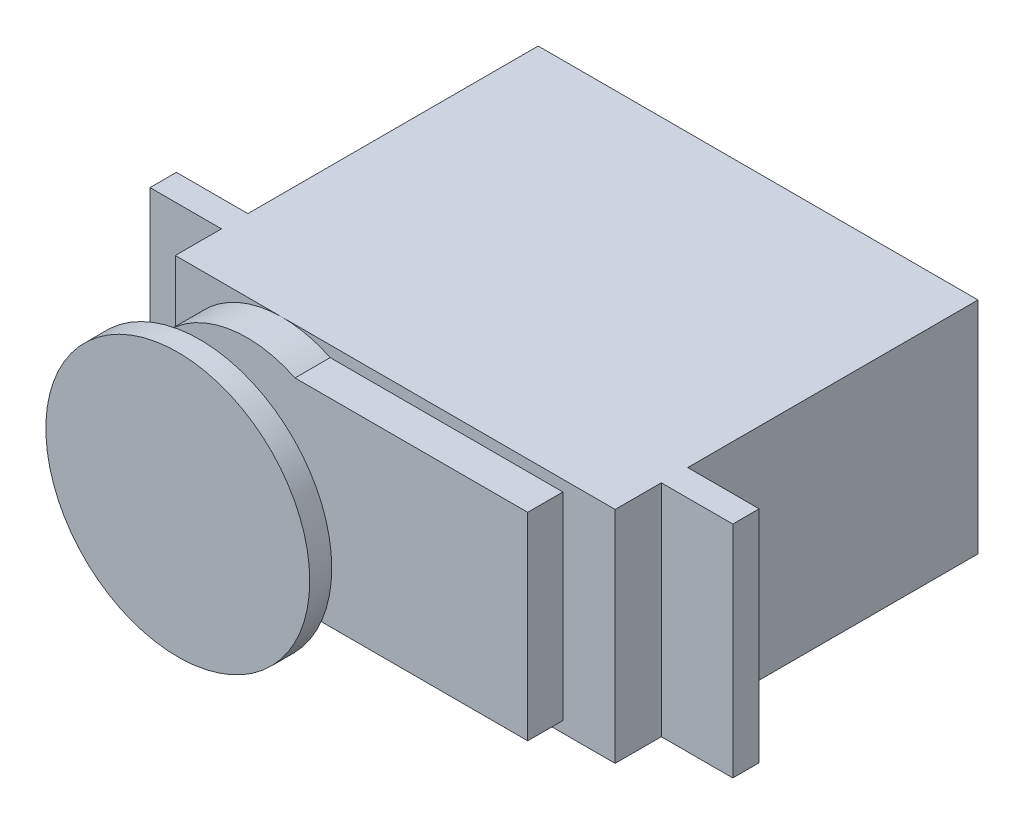
ISO-10303-21;
HEADER;
FILE_DESCRIPTION(('STEP AP214'),'2;1');
FILE_NAME('part.step','',(''),(''),'','','');
FILE_SCHEMA(('AUTOMOTIVE_DESIGN { 1 0 10303 214 1 1 1 1 }'));
ENDSEC;
DATA;
#1=APPLICATION_CONTEXT('core data for automotive mechanical design processes');
#2=APPLICATION_PROTOCOL_DEFINITION('international standard','automotive_design',2000,#1);
#3=PRODUCT_CONTEXT('',#1,'mechanical');
#4=PRODUCT('Part','Part','',(#3));
#5=PRODUCT_RELATED_PRODUCT_CATEGORY('part','',(#4));
#6=PRODUCT_DEFINITION_FORMATION('','',#4);
#7=PRODUCT_DEFINITION_CONTEXT('part definition',#1,'design');
#8=PRODUCT_DEFINITION('design','',#6,#7);
#9=PRODUCT_DEFINITION_SHAPE('','',#8);
#10=(LENGTH_UNIT() NAMED_UNIT(*) SI_UNIT(.MILLI.,.METRE.));
#11=(NAMED_UNIT(*) PLANE_ANGLE_UNIT() SI_UNIT($,.RADIAN.));
#12=(NAMED_UNIT(*) SI_UNIT($,.STERADIAN.) SOLID_ANGLE_UNIT());
#13=UNCERTAINTY_MEASURE_WITH_UNIT(LENGTH_MEASURE(1.E-05),#10,'distance_accuracy_value','');
#14=(GEOMETRIC_REPRESENTATION_CONTEXT(3) GLOBAL_UNCERTAINTY_ASSIGNED_CONTEXT((#13)) GLOBAL_UNIT_ASSIGNED_CONTEXT((#10,
#11,#12)) REPRESENTATION_CONTEXT('',''));
#15=CARTESIAN_POINT('',(0.,0.,0.));
#16=DIRECTION('',(0.,0.,1.));
#17=DIRECTION('',(1.,0.,0.));
#18=AXIS2_PLACEMENT_3D('',#15,#16,#17);
#19=CARTESIAN_POINT('',(9.72641767332185,10.,40.5));
#20=DIRECTION('',(0.,0.,-1.));
#21=DIRECTION('',(-1.,0.,0.));
#22=AXIS2_PLACEMENT_3D('',#19,#20,#21);
#23=CYLINDRICAL_SURFACE('',#22,5.);
#24=CARTESIAN_POINT('',(9.72641767332185,10.,36.2));
#25=DIRECTION('',(0.,0.,1.));
#26=DIRECTION('',(1.,0.,0.));
#27=AXIS2_PLACEMENT_3D('',#24,#25,#26);
#28=CIRCLE('',#27,5.);
#29=CARTESIAN_POINT('',(14.7264176733219,10.,36.2));
#30=VERTEX_POINT('',#29);
#31=EDGE_CURVE('E208',#30,#30,#28,.F.);
#32=ORIENTED_EDGE('',*,*,#31,.F.);
#33=EDGE_LOOP('',(#32));
#34=FACE_BOUND('',#33,.T.);
#35=CARTESIAN_POINT('',(9.72641767332185,10.,40.5));
#36=DIRECTION('',(0.,0.,1.));
#37=DIRECTION('',(1.,0.,0.));
#38=AXIS2_PLACEMENT_3D('',#35,#36,#37);
#39=CIRCLE('',#38,5.);
#40=CARTESIAN_POINT('',(14.7264176733219,10.,40.5));
#41=VERTEX_POINT('',#40);
#42=EDGE_CURVE('E231',#41,#41,#39,.T.);
#43=ORIENTED_EDGE('',*,*,#42,.F.);
#44=EDGE_LOOP('',(#43));
#45=FACE_BOUND('',#44,.T.);
#46=ADVANCED_FACE('F33',(#34,#45),#23,.T.);
#47=CARTESIAN_POINT('',(9.72641767332185,10.,40.5));
#48=DIRECTION('',(0.,0.,1.));
#49=DIRECTION('',(1.,0.,0.));
#50=AXIS2_PLACEMENT_3D('',#47,#48,#49);
#51=PLANE('',#50);
#52=CARTESIAN_POINT('',(9.72641767332185,10.,40.5));
#53=DIRECTION('',(0.,0.,1.));
#54=DIRECTION('',(1.,0.,0.));
#55=AXIS2_PLACEMENT_3D('',#52,#53,#54);
#56=CIRCLE('',#55,12.);
#57=CARTESIAN_POINT('',(21.7264176733219,10.,40.5));
#58=VERTEX_POINT('',#57);
#59=EDGE_CURVE('E176',#58,#58,#56,.T.);
#60=ORIENTED_EDGE('',*,*,#59,.F.);
#61=EDGE_LOOP('',(#60));
#62=FACE_BOUND('',#61,.T.);
#63=ORIENTED_EDGE('',*,*,#42,.T.);
#64=EDGE_LOOP('',(#63));
#65=FACE_BOUND('',#64,.T.);
#66=ADVANCED_FACE('F411',(#62,#65),#51,.F.);
#67=CARTESIAN_POINT('',(9.72641767332185,10.,42.5));
#68=DIRECTION('',(0.,0.,-1.));
#69=DIRECTION('',(-1.,0.,0.));
#70=AXIS2_PLACEMENT_3D('',#67,#68,#69);
#71=CYLINDRICAL_SURFACE('',#70,12.);
#72=CARTESIAN_POINT('',(9.72641767332185,10.,42.5));
#73=DIRECTION('',(0.,0.,1.));
#74=DIRECTION('',(1.,0.,0.));
#75=AXIS2_PLACEMENT_3D('',#72,#73,#74);
#76=CIRCLE('',#75,12.);
#77=CARTESIAN_POINT('',(21.7264176733219,10.,42.5));
#78=VERTEX_POINT('',#77);
#79=EDGE_CURVE('E228',#78,#78,#76,.T.);
#80=ORIENTED_EDGE('',*,*,#79,.F.);
#81=EDGE_LOOP('',(#80));
#82=FACE_BOUND('',#81,.T.);
#83=ORIENTED_EDGE('',*,*,#59,.T.);
#84=EDGE_LOOP('',(#83));
#85=FACE_BOUND('',#84,.T.);
#86=ADVANCED_FACE('F417',(#82,#85),#71,.T.);
#87=CARTESIAN_POINT('',(9.72641767332185,10.,42.5));
#88=DIRECTION('',(0.,0.,1.));
#89=DIRECTION('',(1.,0.,0.));
#90=AXIS2_PLACEMENT_3D('',#87,#88,#89);
#91=PLANE('',#90);
#92=ORIENTED_EDGE('',*,*,#79,.T.);
#93=EDGE_LOOP('',(#92));
#94=FACE_BOUND('',#93,.T.);
#95=ADVANCED_FACE('F482',(#94),#91,.T.);
#96=CARTESIAN_POINT('',(9.72641767332185,10.,36.2));
#97=DIRECTION('',(0.,0.,-1.));
#98=DIRECTION('',(-1.,0.,0.));
#99=AXIS2_PLACEMENT_3D('',#96,#97,#98);
#100=CYLINDRICAL_SURFACE('',#99,10.);
#101=CARTESIAN_POINT('',(9.72641767332185,10.,33.));
#102=DIRECTION('',(0.,0.,1.));
#103=DIRECTION('',(1.,0.,0.));
#104=AXIS2_PLACEMENT_3D('',#101,#102,#103);
#105=CIRCLE('',#104,10.);
#106=CARTESIAN_POINT('',(0.,12.3231012126234,33.));
#107=VERTEX_POINT('',#106);
#108=CARTESIAN_POINT('',(9.72641767332185,20.,33.));
#109=VERTEX_POINT('',#108);
#110=EDGE_CURVE('E173',#107,#109,#105,.F.);
#111=ORIENTED_EDGE('',*,*,#110,.F.);
#112=DIRECTION('',(0.,0.,-1.));
#113=VECTOR('',#112,1.);
#114=CARTESIAN_POINT('',(0.,12.3231012126234,36.2));
#115=LINE('',#114,#113);
#116=CARTESIAN_POINT('',(0.,12.3231012126234,36.2));
#117=VERTEX_POINT('',#116);
#118=EDGE_CURVE('E166',#117,#107,#115,.T.);
#119=ORIENTED_EDGE('',*,*,#118,.F.);
#120=CARTESIAN_POINT('',(9.72641767332185,10.,36.2));
#121=DIRECTION('',(0.,0.,1.));
#122=DIRECTION('',(1.,0.,0.));
#123=AXIS2_PLACEMENT_3D('',#120,#121,#122);
#124=CIRCLE('',#123,10.);
#125=CARTESIAN_POINT('',(14.0853166168625,19.,36.2));
#126=VERTEX_POINT('',#125);
#127=EDGE_CURVE('E171',#117,#126,#124,.F.);
#128=ORIENTED_EDGE('',*,*,#127,.T.);
#129=DIRECTION('',(0.,0.,-1.));
#130=VECTOR('',#129,1.);
#131=CARTESIAN_POINT('',(14.0853166168625,19.,36.2));
#132=LINE('',#131,#130);
#133=CARTESIAN_POINT('',(14.0853166168625,19.,33.));
#134=VERTEX_POINT('',#133);
#135=EDGE_CURVE('E211',#126,#134,#132,.T.);
#136=ORIENTED_EDGE('',*,*,#135,.T.);
#137=EDGE_CURVE('E214',#109,#134,#105,.F.);
#138=ORIENTED_EDGE('',*,*,#137,.F.);
#139=EDGE_LOOP('',(#111,#119,#128,#136,#138));
#140=FACE_BOUND('',#139,.T.);
#141=ADVANCED_FACE('F168',(#140),#100,.T.);
#142=CARTESIAN_POINT('',(9.72641767332185,10.,36.2));
#143=DIRECTION('',(0.,0.,-1.));
#144=DIRECTION('',(-1.,0.,0.));
#145=AXIS2_PLACEMENT_3D('',#142,#143,#144);
#146=CYLINDRICAL_SURFACE('',#145,10.);
#147=CARTESIAN_POINT('',(9.72641767332185,10.,33.));
#148=DIRECTION('',(0.,0.,1.));
#149=DIRECTION('',(1.,0.,0.));
#150=AXIS2_PLACEMENT_3D('',#147,#148,#149);
#151=CIRCLE('',#150,10.);
#152=CARTESIAN_POINT('',(14.0853166168625,0.999999999999996,33.));
#153=VERTEX_POINT('',#152);
#154=CARTESIAN_POINT('',(9.72641767332185,0.,33.));
#155=VERTEX_POINT('',#154);
#156=EDGE_CURVE('E215',#153,#155,#151,.F.);
#157=ORIENTED_EDGE('',*,*,#156,.F.);
#158=DIRECTION('',(0.,0.,-1.));
#159=VECTOR('',#158,1.);
#160=CARTESIAN_POINT('',(14.0853166168625,0.999999999999997,36.2));
#161=LINE('',#160,#159);
#162=CARTESIAN_POINT('',(14.0853166168625,0.999999999999997,36.2));
#163=VERTEX_POINT('',#162);
#164=EDGE_CURVE('E225',#163,#153,#161,.T.);
#165=ORIENTED_EDGE('',*,*,#164,.F.);
#166=CARTESIAN_POINT('',(9.72641767332185,10.,36.2));
#167=DIRECTION('',(0.,0.,1.));
#168=DIRECTION('',(1.,0.,0.));
#169=AXIS2_PLACEMENT_3D('',#166,#167,#168);
#170=CIRCLE('',#169,10.);
#171=CARTESIAN_POINT('',(0.,7.6768987873766,36.2));
#172=VERTEX_POINT('',#171);
#173=EDGE_CURVE('E187',#163,#172,#170,.F.);
#174=ORIENTED_EDGE('',*,*,#173,.T.);
#175=DIRECTION('',(0.,0.,-1.));
#176=VECTOR('',#175,1.);
#177=CARTESIAN_POINT('',(0.,7.6768987873766,36.2));
#178=LINE('',#177,#176);
#179=CARTESIAN_POINT('',(0.,7.6768987873766,33.));
#180=VERTEX_POINT('',#179);
#181=EDGE_CURVE('E177',#172,#180,#178,.T.);
#182=ORIENTED_EDGE('',*,*,#181,.T.);
#183=EDGE_CURVE('E213',#155,#180,#151,.F.);
#184=ORIENTED_EDGE('',*,*,#183,.F.);
#185=EDGE_LOOP('',(#157,#165,#174,#182,#184));
#186=FACE_BOUND('',#185,.T.);
#187=ADVANCED_FACE('F377',(#186),#146,.T.);
#188=CARTESIAN_POINT('',(19.8632088366609,0.999999999999997,36.2));
#189=DIRECTION('',(0.,-1.,0.));
#190=DIRECTION('',(1.,0.,0.));
#191=AXIS2_PLACEMENT_3D('',#188,#189,#190);
#192=PLANE('',#191);
#193=DIRECTION('',(-1.,0.,0.));
#194=VECTOR('',#193,1.);
#195=CARTESIAN_POINT('',(19.8632088366609,0.999999999999997,33.));
#196=LINE('',#195,#194);
#197=CARTESIAN_POINT('',(35.25,1.,33.));
#198=VERTEX_POINT('',#197);
#199=EDGE_CURVE('E50',#198,#153,#196,.T.);
#200=ORIENTED_EDGE('',*,*,#199,.F.);
#201=DIRECTION('',(0.,0.,-1.));
#202=VECTOR('',#201,1.);
#203=CARTESIAN_POINT('',(35.25,1.,36.2));
#204=LINE('',#203,#202);
#205=CARTESIAN_POINT('',(35.25,1.,36.2));
#206=VERTEX_POINT('',#205);
#207=EDGE_CURVE('E223',#206,#198,#204,.T.);
#208=ORIENTED_EDGE('',*,*,#207,.F.);
#209=DIRECTION('',(-1.,0.,0.));
#210=VECTOR('',#209,1.);
#211=CARTESIAN_POINT('',(19.8632088366609,0.999999999999997,36.2));
#212=LINE('',#211,#210);
#213=EDGE_CURVE('E201',#206,#163,#212,.T.);
#214=ORIENTED_EDGE('',*,*,#213,.T.);
#215=ORIENTED_EDGE('',*,*,#164,.T.);
#216=EDGE_LOOP('',(#200,#208,#214,#215));
#217=FACE_BOUND('',#216,.T.);
#218=ADVANCED_FACE('F380',(#217),#192,.T.);
#219=CARTESIAN_POINT('',(35.25,-25.116936609359,36.2));
#220=DIRECTION('',(1.,0.,0.));
#221=DIRECTION('',(0.,0.,-1.));
#222=AXIS2_PLACEMENT_3D('',#219,#220,#221);
#223=PLANE('',#222);
#224=DIRECTION('',(0.,-1.,0.));
#225=VECTOR('',#224,1.);
#226=CARTESIAN_POINT('',(35.25,-25.116936609359,33.));
#227=LINE('',#226,#225);
#228=CARTESIAN_POINT('',(35.25,19.,33.));
#229=VERTEX_POINT('',#228);
#230=EDGE_CURVE('E55',#229,#198,#227,.T.);
#231=ORIENTED_EDGE('',*,*,#230,.F.);
#232=DIRECTION('',(0.,0.,-1.));
#233=VECTOR('',#232,1.);
#234=CARTESIAN_POINT('',(35.25,19.,36.2));
#235=LINE('',#234,#233);
#236=CARTESIAN_POINT('',(35.25,19.,36.2));
#237=VERTEX_POINT('',#236);
#238=EDGE_CURVE('E220',#237,#229,#235,.T.);
#239=ORIENTED_EDGE('',*,*,#238,.F.);
#240=DIRECTION('',(0.,-1.,0.));
#241=VECTOR('',#240,1.);
#242=CARTESIAN_POINT('',(35.25,-25.116936609359,36.2));
#243=LINE('',#242,#241);
#244=EDGE_CURVE('E204',#237,#206,#243,.T.);
#245=ORIENTED_EDGE('',*,*,#244,.T.);
#246=ORIENTED_EDGE('',*,*,#207,.T.);
#247=EDGE_LOOP('',(#231,#239,#245,#246));
#248=FACE_BOUND('',#247,.T.);
#249=ADVANCED_FACE('F382',(#248),#223,.T.);
#250=CARTESIAN_POINT('',(19.8632088366609,19.,36.2));
#251=DIRECTION('',(0.,-1.,0.));
#252=DIRECTION('',(1.,0.,0.));
#253=AXIS2_PLACEMENT_3D('',#250,#251,#252);
#254=PLANE('',#253);
#255=DIRECTION('',(-1.,0.,0.));
#256=VECTOR('',#255,1.);
#257=CARTESIAN_POINT('',(19.8632088366609,19.,33.));
#258=LINE('',#257,#256);
#259=EDGE_CURVE('E195',#229,#134,#258,.T.);
#260=ORIENTED_EDGE('',*,*,#259,.T.);
#261=ORIENTED_EDGE('',*,*,#135,.F.);
#262=DIRECTION('',(-1.,0.,0.));
#263=VECTOR('',#262,1.);
#264=CARTESIAN_POINT('',(19.8632088366609,19.,36.2));
#265=LINE('',#264,#263);
#266=EDGE_CURVE('E193',#237,#126,#265,.T.);
#267=ORIENTED_EDGE('',*,*,#266,.F.);
#268=ORIENTED_EDGE('',*,*,#238,.T.);
#269=EDGE_LOOP('',(#260,#261,#267,#268));
#270=FACE_BOUND('',#269,.T.);
#271=ADVANCED_FACE('F384',(#270),#254,.F.);
#272=CARTESIAN_POINT('',(19.8632088366609,-25.116936609359,36.2));
#273=DIRECTION('',(0.,0.,1.));
#274=DIRECTION('',(1.,0.,0.));
#275=AXIS2_PLACEMENT_3D('',#272,#273,#274);
#276=PLANE('',#275);
#277=ORIENTED_EDGE('',*,*,#127,.F.);
#278=DIRECTION('',(0.,-1.,0.));
#279=VECTOR('',#278,1.);
#280=CARTESIAN_POINT('',(0.,-25.116936609359,36.2));
#281=LINE('',#280,#279);
#282=EDGE_CURVE('E180',#117,#172,#281,.T.);
#283=ORIENTED_EDGE('',*,*,#282,.T.);
#284=ORIENTED_EDGE('',*,*,#173,.F.);
#285=ORIENTED_EDGE('',*,*,#213,.F.);
#286=ORIENTED_EDGE('',*,*,#244,.F.);
#287=ORIENTED_EDGE('',*,*,#266,.T.);
#288=EDGE_LOOP('',(#277,#283,#284,#285,#286,#287));
#289=FACE_BOUND('',#288,.T.);
#290=ORIENTED_EDGE('',*,*,#31,.T.);
#291=EDGE_LOOP('',(#290));
#292=FACE_BOUND('',#291,.T.);
#293=ADVANCED_FACE('F189',(#289,#292),#276,.T.);
#294=CARTESIAN_POINT('',(46.5,0.,28.8));
#295=DIRECTION('',(1.,0.,0.));
#296=DIRECTION('',(0.,0.,-1.));
#297=AXIS2_PLACEMENT_3D('',#294,#295,#296);
#298=PLANE('',#297);
#299=DIRECTION('',(0.,-1.,0.));
#300=VECTOR('',#299,1.);
#301=CARTESIAN_POINT('',(46.5,20.,28.8));
#302=LINE('',#301,#300);
#303=CARTESIAN_POINT('',(46.5,20.,28.8));
#304=VERTEX_POINT('',#303);
#305=CARTESIAN_POINT('',(46.5,0.,28.8));
#306=VERTEX_POINT('',#305);
#307=EDGE_CURVE('E264',#304,#306,#302,.T.);
#308=ORIENTED_EDGE('',*,*,#307,.T.);
#309=DIRECTION('',(0.,0.,-1.));
#310=VECTOR('',#309,1.);
#311=CARTESIAN_POINT('',(46.5,0.,28.8));
#312=LINE('',#311,#310);
#313=CARTESIAN_POINT('',(46.5,0.,26.4));
#314=VERTEX_POINT('',#313);
#315=EDGE_CURVE('E267',#306,#314,#312,.T.);
#316=ORIENTED_EDGE('',*,*,#315,.T.);
#317=DIRECTION('',(0.,1.,0.));
#318=VECTOR('',#317,1.);
#319=CARTESIAN_POINT('',(46.5,20.,26.4));
#320=LINE('',#319,#318);
#321=CARTESIAN_POINT('',(46.5,20.,26.4));
#322=VERTEX_POINT('',#321);
#323=EDGE_CURVE('E270',#314,#322,#320,.T.);
#324=ORIENTED_EDGE('',*,*,#323,.T.);
#325=DIRECTION('',(0.,0.,1.));
#326=VECTOR('',#325,1.);
#327=CARTESIAN_POINT('',(46.5,20.,28.8));
#328=LINE('',#327,#326);
#329=EDGE_CURVE('E272',#322,#304,#328,.T.);
#330=ORIENTED_EDGE('',*,*,#329,.T.);
#331=EDGE_LOOP('',(#308,#316,#324,#330));
#332=FACE_BOUND('',#331,.T.);
#333=ADVANCED_FACE('F429',(#332),#298,.T.);
#334=CARTESIAN_POINT('',(46.5,20.,28.8));
#335=DIRECTION('',(0.,0.,-1.));
#336=DIRECTION('',(0.,1.,0.));
#337=AXIS2_PLACEMENT_3D('',#334,#335,#336);
#338=PLANE('',#337);
#339=DIRECTION('',(0.,-1.,0.));
#340=VECTOR('',#339,1.);
#341=CARTESIAN_POINT('',(40.,20.,28.8));
#342=LINE('',#341,#340);
#343=CARTESIAN_POINT('',(40.,20.,28.8));
#344=VERTEX_POINT('',#343);
#345=CARTESIAN_POINT('',(40.,0.,28.8));
#346=VERTEX_POINT('',#345);
#347=EDGE_CURVE('E263',#344,#346,#342,.T.);
#348=ORIENTED_EDGE('',*,*,#347,.T.);
#349=DIRECTION('',(-1.,0.,0.));
#350=VECTOR('',#349,1.);
#351=CARTESIAN_POINT('',(46.5,0.,28.8));
#352=LINE('',#351,#350);
#353=EDGE_CURVE('E296',#306,#346,#352,.T.);
#354=ORIENTED_EDGE('',*,*,#353,.F.);
#355=ORIENTED_EDGE('',*,*,#307,.F.);
#356=DIRECTION('',(-1.,0.,0.));
#357=VECTOR('',#356,1.);
#358=CARTESIAN_POINT('',(46.5,20.,28.8));
#359=LINE('',#358,#357);
#360=EDGE_CURVE('E274',#304,#344,#359,.T.);
#361=ORIENTED_EDGE('',*,*,#360,.T.);
#362=EDGE_LOOP('',(#348,#354,#355,#361));
#363=FACE_BOUND('',#362,.T.);
#364=ADVANCED_FACE('F425',(#363),#338,.F.);
#365=CARTESIAN_POINT('',(-6.50000000000001,0.,28.8));
#366=DIRECTION('',(1.,0.,0.));
#367=DIRECTION('',(0.,0.,-1.));
#368=AXIS2_PLACEMENT_3D('',#365,#366,#367);
#369=PLANE('',#368);
#370=DIRECTION('',(0.,-1.,0.));
#371=VECTOR('',#370,1.);
#372=CARTESIAN_POINT('',(-6.50000000000001,20.,28.8));
#373=LINE('',#372,#371);
#374=CARTESIAN_POINT('',(-6.50000000000001,20.,28.8));
#375=VERTEX_POINT('',#374);
#376=CARTESIAN_POINT('',(-6.50000000000001,0.,28.8));
#377=VERTEX_POINT('',#376);
#378=EDGE_CURVE('E236',#375,#377,#373,.T.);
#379=ORIENTED_EDGE('',*,*,#378,.F.);
#380=DIRECTION('',(0.,0.,1.));
#381=VECTOR('',#380,1.);
#382=CARTESIAN_POINT('',(-6.50000000000001,20.,28.8));
#383=LINE('',#382,#381);
#384=CARTESIAN_POINT('',(-6.50000000000001,20.,26.4));
#385=VERTEX_POINT('',#384);
#386=EDGE_CURVE('E245',#385,#375,#383,.T.);
#387=ORIENTED_EDGE('',*,*,#386,.F.);
#388=DIRECTION('',(0.,1.,0.));
#389=VECTOR('',#388,1.);
#390=CARTESIAN_POINT('',(-6.50000000000001,20.,26.4));
#391=LINE('',#390,#389);
#392=CARTESIAN_POINT('',(-6.50000000000001,0.,26.4));
#393=VERTEX_POINT('',#392);
#394=EDGE_CURVE('E242',#393,#385,#391,.T.);
#395=ORIENTED_EDGE('',*,*,#394,.F.);
#396=DIRECTION('',(0.,0.,-1.));
#397=VECTOR('',#396,1.);
#398=CARTESIAN_POINT('',(-6.50000000000001,0.,28.8));
#399=LINE('',#398,#397);
#400=EDGE_CURVE('E239',#377,#393,#399,.T.);
#401=ORIENTED_EDGE('',*,*,#400,.F.);
#402=EDGE_LOOP('',(#379,#387,#395,#401));
#403=FACE_BOUND('',#402,.T.);
#404=ADVANCED_FACE('F398',(#403),#369,.F.);
#405=CARTESIAN_POINT('',(-6.50000000000001,20.,26.4));
#406=DIRECTION('',(0.,0.,-1.));
#407=DIRECTION('',(0.,1.,0.));
#408=AXIS2_PLACEMENT_3D('',#405,#406,#407);
#409=PLANE('',#408);
#410=DIRECTION('',(0.,1.,0.));
#411=VECTOR('',#410,1.);
#412=CARTESIAN_POINT('',(0.,0.,26.4));
#413=LINE('',#412,#411);
#414=CARTESIAN_POINT('',(0.,0.,26.4));
#415=VERTEX_POINT('',#414);
#416=CARTESIAN_POINT('',(0.,20.,26.4));
#417=VERTEX_POINT('',#416);
#418=EDGE_CURVE('E252',#415,#417,#413,.T.);
#419=ORIENTED_EDGE('',*,*,#418,.F.);
#420=DIRECTION('',(1.,0.,0.));
#421=VECTOR('',#420,1.);
#422=CARTESIAN_POINT('',(-6.50000000000001,0.,26.4));
#423=LINE('',#422,#421);
#424=EDGE_CURVE('E255',#393,#415,#423,.T.);
#425=ORIENTED_EDGE('',*,*,#424,.F.);
#426=ORIENTED_EDGE('',*,*,#394,.T.);
#427=DIRECTION('',(1.,0.,0.));
#428=VECTOR('',#427,1.);
#429=CARTESIAN_POINT('',(-6.50000000000001,20.,26.4));
#430=LINE('',#429,#428);
#431=EDGE_CURVE('E253',#385,#417,#430,.T.);
#432=ORIENTED_EDGE('',*,*,#431,.T.);
#433=EDGE_LOOP('',(#419,#425,#426,#432));
#434=FACE_BOUND('',#433,.T.);
#435=ADVANCED_FACE('F401',(#434),#409,.T.);
#436=CARTESIAN_POINT('',(0.,0.,33.));
#437=DIRECTION('',(1.,0.,0.));
#438=DIRECTION('',(0.,0.,-1.));
#439=AXIS2_PLACEMENT_3D('',#436,#437,#438);
#440=PLANE('',#439);
#441=DIRECTION('',(0.,0.,-1.));
#442=VECTOR('',#441,1.);
#443=CARTESIAN_POINT('',(0.,0.,33.));
#444=LINE('',#443,#442);
#445=CARTESIAN_POINT('',(0.,0.,0.));
#446=VERTEX_POINT('',#445);
#447=EDGE_CURVE('E42',#415,#446,#444,.T.);
#448=ORIENTED_EDGE('',*,*,#447,.F.);
#449=ORIENTED_EDGE('',*,*,#418,.T.);
#450=DIRECTION('',(0.,0.,-1.));
#451=VECTOR('',#450,1.);
#452=CARTESIAN_POINT('',(0.,20.,33.));
#453=LINE('',#452,#451);
#454=CARTESIAN_POINT('',(0.,20.,0.));
#455=VERTEX_POINT('',#454);
#456=EDGE_CURVE('E331',#417,#455,#453,.T.);
#457=ORIENTED_EDGE('',*,*,#456,.T.);
#458=DIRECTION('',(0.,-1.,0.));
#459=VECTOR('',#458,1.);
#460=CARTESIAN_POINT('',(0.,0.,0.));
#461=LINE('',#460,#459);
#462=EDGE_CURVE('E305',#455,#446,#461,.T.);
#463=ORIENTED_EDGE('',*,*,#462,.T.);
#464=EDGE_LOOP('',(#448,#449,#457,#463));
#465=FACE_BOUND('',#464,.T.);
#466=ADVANCED_FACE('F35',(#465),#440,.F.);
#467=CARTESIAN_POINT('',(0.,20.,0.));
#468=DIRECTION('',(0.,0.,-1.));
#469=DIRECTION('',(-1.,0.,0.));
#470=AXIS2_PLACEMENT_3D('',#467,#468,#469);
#471=PLANE('',#470);
#472=ORIENTED_EDGE('',*,*,#462,.F.);
#473=DIRECTION('',(-1.,0.,0.));
#474=VECTOR('',#473,1.);
#475=CARTESIAN_POINT('',(0.,20.,0.));
#476=LINE('',#475,#474);
#477=CARTESIAN_POINT('',(40.,20.,0.));
#478=VERTEX_POINT('',#477);
#479=EDGE_CURVE('E324',#478,#455,#476,.T.);
#480=ORIENTED_EDGE('',*,*,#479,.F.);
#481=DIRECTION('',(0.,1.,0.));
#482=VECTOR('',#481,1.);
#483=CARTESIAN_POINT('',(40.,0.,0.));
#484=LINE('',#483,#482);
#485=CARTESIAN_POINT('',(40.,0.,0.));
#486=VERTEX_POINT('',#485);
#487=EDGE_CURVE('E316',#486,#478,#484,.T.);
#488=ORIENTED_EDGE('',*,*,#487,.F.);
#489=DIRECTION('',(1.,0.,0.));
#490=VECTOR('',#489,1.);
#491=CARTESIAN_POINT('',(0.,0.,0.));
#492=LINE('',#491,#490);
#493=EDGE_CURVE('E310',#446,#486,#492,.T.);
#494=ORIENTED_EDGE('',*,*,#493,.F.);
#495=EDGE_LOOP('',(#472,#480,#488,#494));
#496=FACE_BOUND('',#495,.T.);
#497=ADVANCED_FACE('F355',(#496),#471,.T.);
#498=CARTESIAN_POINT('',(40.,0.,33.));
#499=DIRECTION('',(-1.,0.,0.));
#500=DIRECTION('',(0.,0.,1.));
#501=AXIS2_PLACEMENT_3D('',#498,#499,#500);
#502=PLANE('',#501);
#503=DIRECTION('',(0.,1.,0.));
#504=VECTOR('',#503,1.);
#505=CARTESIAN_POINT('',(40.,20.,26.4));
#506=LINE('',#505,#504);
#507=CARTESIAN_POINT('',(40.,0.,26.4));
#508=VERTEX_POINT('',#507);
#509=CARTESIAN_POINT('',(40.,20.,26.4));
#510=VERTEX_POINT('',#509);
#511=EDGE_CURVE('E268',#508,#510,#506,.T.);
#512=ORIENTED_EDGE('',*,*,#511,.F.);
#513=DIRECTION('',(0.,0.,-1.));
#514=VECTOR('',#513,1.);
#515=CARTESIAN_POINT('',(40.,0.,33.));
#516=LINE('',#515,#514);
#517=EDGE_CURVE('E341',#508,#486,#516,.T.);
#518=ORIENTED_EDGE('',*,*,#517,.T.);
#519=ORIENTED_EDGE('',*,*,#487,.T.);
#520=DIRECTION('',(0.,0.,-1.));
#521=VECTOR('',#520,1.);
#522=CARTESIAN_POINT('',(40.,20.,33.));
#523=LINE('',#522,#521);
#524=EDGE_CURVE('E330',#510,#478,#523,.T.);
#525=ORIENTED_EDGE('',*,*,#524,.F.);
#526=EDGE_LOOP('',(#512,#518,#519,#525));
#527=FACE_BOUND('',#526,.T.);
#528=ADVANCED_FACE('F351',(#527),#502,.F.);
#529=CARTESIAN_POINT('',(46.5,20.,26.4));
#530=DIRECTION('',(0.,0.,1.));
#531=DIRECTION('',(0.,-1.,0.));
#532=AXIS2_PLACEMENT_3D('',#529,#530,#531);
#533=PLANE('',#532);
#534=ORIENTED_EDGE('',*,*,#511,.T.);
#535=DIRECTION('',(-1.,0.,0.));
#536=VECTOR('',#535,1.);
#537=CARTESIAN_POINT('',(46.5,20.,26.4));
#538=LINE('',#537,#536);
#539=EDGE_CURVE('E285',#322,#510,#538,.T.);
#540=ORIENTED_EDGE('',*,*,#539,.F.);
#541=ORIENTED_EDGE('',*,*,#323,.F.);
#542=DIRECTION('',(-1.,0.,0.));
#543=VECTOR('',#542,1.);
#544=CARTESIAN_POINT('',(46.5,0.,26.4));
#545=LINE('',#544,#543);
#546=EDGE_CURVE('E290',#314,#508,#545,.T.);
#547=ORIENTED_EDGE('',*,*,#546,.T.);
#548=EDGE_LOOP('',(#534,#540,#541,#547));
#549=FACE_BOUND('',#548,.T.);
#550=ADVANCED_FACE('F433',(#549),#533,.F.);
#551=ORIENTED_EDGE('',*,*,#347,.F.);
#552=CARTESIAN_POINT('',(40.,20.,33.));
#553=VERTEX_POINT('',#552);
#554=EDGE_CURVE('E339',#553,#344,#523,.T.);
#555=ORIENTED_EDGE('',*,*,#554,.F.);
#556=DIRECTION('',(0.,1.,0.));
#557=VECTOR('',#556,1.);
#558=CARTESIAN_POINT('',(40.,0.,33.));
#559=LINE('',#558,#557);
#560=CARTESIAN_POINT('',(40.,0.,33.));
#561=VERTEX_POINT('',#560);
#562=EDGE_CURVE('E362',#561,#553,#559,.T.);
#563=ORIENTED_EDGE('',*,*,#562,.F.);
#564=EDGE_CURVE('E344',#561,#346,#516,.T.);
#565=ORIENTED_EDGE('',*,*,#564,.T.);
#566=EDGE_LOOP('',(#551,#555,#563,#565));
#567=FACE_BOUND('',#566,.T.);
#568=ADVANCED_FACE('F361',(#567),#502,.F.);
#569=CARTESIAN_POINT('',(0.,0.,33.));
#570=DIRECTION('',(0.,1.,0.));
#571=DIRECTION('',(0.,0.,1.));
#572=AXIS2_PLACEMENT_3D('',#569,#570,#571);
#573=PLANE('',#572);
#574=ORIENTED_EDGE('',*,*,#353,.T.);
#575=ORIENTED_EDGE('',*,*,#564,.F.);
#576=DIRECTION('',(1.,0.,0.));
#577=VECTOR('',#576,1.);
#578=CARTESIAN_POINT('',(0.,0.,33.));
#579=LINE('',#578,#577);
#580=EDGE_CURVE('E365',#155,#561,#579,.T.);
#581=ORIENTED_EDGE('',*,*,#580,.F.);
#582=CARTESIAN_POINT('',(0.,0.,33.));
#583=VERTEX_POINT('',#582);
#584=EDGE_CURVE('E367',#583,#155,#579,.T.);
#585=ORIENTED_EDGE('',*,*,#584,.F.);
#586=CARTESIAN_POINT('',(0.,0.,28.8));
#587=VERTEX_POINT('',#586);
#588=EDGE_CURVE('E11',#583,#587,#444,.T.);
#589=ORIENTED_EDGE('',*,*,#588,.T.);
#590=DIRECTION('',(1.,0.,0.));
#591=VECTOR('',#590,1.);
#592=CARTESIAN_POINT('',(-6.50000000000001,0.,28.8));
#593=LINE('',#592,#591);
#594=EDGE_CURVE('E248',#377,#587,#593,.T.);
#595=ORIENTED_EDGE('',*,*,#594,.F.);
#596=ORIENTED_EDGE('',*,*,#400,.T.);
#597=ORIENTED_EDGE('',*,*,#424,.T.);
#598=ORIENTED_EDGE('',*,*,#447,.T.);
#599=ORIENTED_EDGE('',*,*,#493,.T.);
#600=ORIENTED_EDGE('',*,*,#517,.F.);
#601=ORIENTED_EDGE('',*,*,#546,.F.);
#602=ORIENTED_EDGE('',*,*,#315,.F.);
#603=EDGE_LOOP('',(#574,#575,#581,#585,#589,#595,#596,#597,#598,#599,#600,#601,#602));
#604=FACE_BOUND('',#603,.T.);
#605=ADVANCED_FACE('F356',(#604),#573,.F.);
#606=CARTESIAN_POINT('',(-6.50000000000001,20.,28.8));
#607=DIRECTION('',(0.,0.,1.));
#608=DIRECTION('',(0.,-1.,0.));
#609=AXIS2_PLACEMENT_3D('',#606,#607,#608);
#610=PLANE('',#609);
#611=DIRECTION('',(0.,-1.,0.));
#612=VECTOR('',#611,1.);
#613=CARTESIAN_POINT('',(0.,0.,28.8));
#614=LINE('',#613,#612);
#615=CARTESIAN_POINT('',(0.,20.,28.8));
#616=VERTEX_POINT('',#615);
#617=EDGE_CURVE('E260',#616,#587,#614,.T.);
#618=ORIENTED_EDGE('',*,*,#617,.F.);
#619=DIRECTION('',(1.,0.,0.));
#620=VECTOR('',#619,1.);
#621=CARTESIAN_POINT('',(-6.50000000000001,20.,28.8));
#622=LINE('',#621,#620);
#623=EDGE_CURVE('E249',#375,#616,#622,.T.);
#624=ORIENTED_EDGE('',*,*,#623,.F.);
#625=ORIENTED_EDGE('',*,*,#378,.T.);
#626=ORIENTED_EDGE('',*,*,#594,.T.);
#627=EDGE_LOOP('',(#618,#624,#625,#626));
#628=FACE_BOUND('',#627,.T.);
#629=ADVANCED_FACE('F395',(#628),#610,.T.);
#630=CARTESIAN_POINT('',(0.,20.,33.));
#631=DIRECTION('',(0.,0.,-1.));
#632=DIRECTION('',(-1.,0.,0.));
#633=AXIS2_PLACEMENT_3D('',#630,#631,#632);
#634=PLANE('',#633);
#635=DIRECTION('',(-1.,0.,0.));
#636=VECTOR('',#635,1.);
#637=CARTESIAN_POINT('',(0.,20.,33.));
#638=LINE('',#637,#636);
#639=EDGE_CURVE('E319',#553,#109,#638,.T.);
#640=ORIENTED_EDGE('',*,*,#639,.T.);
#641=ORIENTED_EDGE('',*,*,#137,.T.);
#642=ORIENTED_EDGE('',*,*,#259,.F.);
#643=ORIENTED_EDGE('',*,*,#230,.T.);
#644=ORIENTED_EDGE('',*,*,#199,.T.);
#645=ORIENTED_EDGE('',*,*,#156,.T.);
#646=ORIENTED_EDGE('',*,*,#580,.T.);
#647=ORIENTED_EDGE('',*,*,#562,.T.);
#648=EDGE_LOOP('',(#640,#641,#642,#643,#644,#645,#646,#647));
#649=FACE_BOUND('',#648,.T.);
#650=ADVANCED_FACE('F386',(#649),#634,.F.);
#651=CARTESIAN_POINT('',(0.,20.,33.));
#652=DIRECTION('',(0.,-1.,0.));
#653=DIRECTION('',(0.,0.,-1.));
#654=AXIS2_PLACEMENT_3D('',#651,#652,#653);
#655=PLANE('',#654);
#656=ORIENTED_EDGE('',*,*,#539,.T.);
#657=ORIENTED_EDGE('',*,*,#524,.T.);
#658=ORIENTED_EDGE('',*,*,#479,.T.);
#659=ORIENTED_EDGE('',*,*,#456,.F.);
#660=ORIENTED_EDGE('',*,*,#431,.F.);
#661=ORIENTED_EDGE('',*,*,#386,.T.);
#662=ORIENTED_EDGE('',*,*,#623,.T.);
#663=CARTESIAN_POINT('',(0.,20.,33.));
#664=VERTEX_POINT('',#663);
#665=EDGE_CURVE('E328',#664,#616,#453,.T.);
#666=ORIENTED_EDGE('',*,*,#665,.F.);
#667=EDGE_CURVE('E388',#109,#664,#638,.T.);
#668=ORIENTED_EDGE('',*,*,#667,.F.);
#669=ORIENTED_EDGE('',*,*,#639,.F.);
#670=ORIENTED_EDGE('',*,*,#554,.T.);
#671=ORIENTED_EDGE('',*,*,#360,.F.);
#672=ORIENTED_EDGE('',*,*,#329,.F.);
#673=EDGE_LOOP('',(#656,#657,#658,#659,#660,#661,#662,#666,#668,#669,#670,#671,#672));
#674=FACE_BOUND('',#673,.T.);
#675=ADVANCED_FACE('F345',(#674),#655,.F.);
#676=ORIENTED_EDGE('',*,*,#665,.T.);
#677=ORIENTED_EDGE('',*,*,#617,.T.);
#678=ORIENTED_EDGE('',*,*,#588,.F.);
#679=DIRECTION('',(0.,-1.,0.));
#680=VECTOR('',#679,1.);
#681=CARTESIAN_POINT('',(0.,0.,33.));
#682=LINE('',#681,#680);
#683=EDGE_CURVE('E327',#180,#583,#682,.T.);
#684=ORIENTED_EDGE('',*,*,#683,.F.);
#685=ORIENTED_EDGE('',*,*,#181,.F.);
#686=ORIENTED_EDGE('',*,*,#282,.F.);
#687=ORIENTED_EDGE('',*,*,#118,.T.);
#688=EDGE_CURVE('E369',#664,#107,#682,.T.);
#689=ORIENTED_EDGE('',*,*,#688,.F.);
#690=EDGE_LOOP('',(#676,#677,#678,#684,#685,#686,#687,#689));
#691=FACE_BOUND('',#690,.T.);
#692=ADVANCED_FACE('F182',(#691),#440,.F.);
#693=ORIENTED_EDGE('',*,*,#584,.T.);
#694=ORIENTED_EDGE('',*,*,#183,.T.);
#695=ORIENTED_EDGE('',*,*,#683,.T.);
#696=EDGE_LOOP('',(#693,#694,#695));
#697=FACE_BOUND('',#696,.T.);
#698=ADVANCED_FACE('F374',(#697),#634,.F.);
#699=ORIENTED_EDGE('',*,*,#688,.T.);
#700=ORIENTED_EDGE('',*,*,#110,.T.);
#701=ORIENTED_EDGE('',*,*,#667,.T.);
#702=EDGE_LOOP('',(#699,#700,#701));
#703=FACE_BOUND('',#702,.T.);
#704=ADVANCED_FACE('F391',(#703),#634,.F.);
#705=CLOSED_SHELL('',(#46,#66,#86,#95,#141,#187,#218,#249,#271,#293,#333,#364,#404,#435,#466,
#497,#528,#550,#568,#605,#629,#650,#675,#692,#698,#704));
#706=MANIFOLD_SOLID_BREP('B2',#705);
#707=ADVANCED_BREP_SHAPE_REPRESENTATION('',(#18,#706),#14);
#708=SHAPE_DEFINITION_REPRESENTATION(#9,#707);
ENDSEC;
END-ISO-10303-21;
